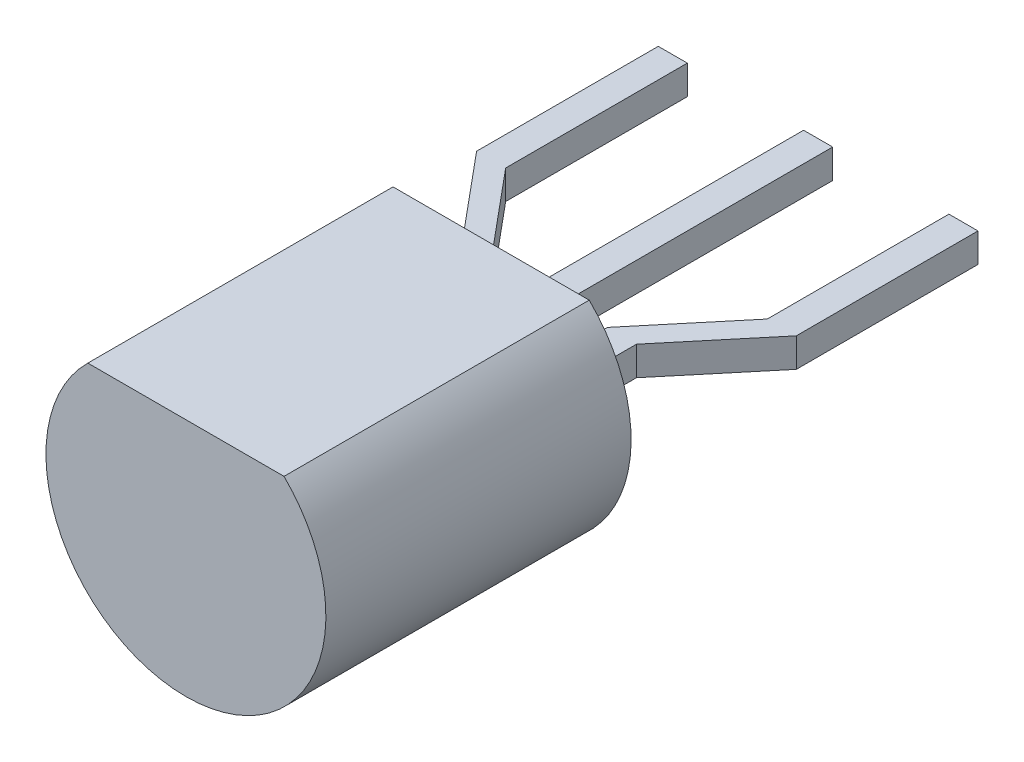
ISO-10303-21;
HEADER;
FILE_DESCRIPTION(('STEP AP214'),'2;1');
FILE_NAME('part.step','',(''),(''),'','','');
FILE_SCHEMA(('AUTOMOTIVE_DESIGN { 1 0 10303 214 1 1 1 1 }'));
ENDSEC;
DATA;
#1=APPLICATION_CONTEXT('core data for automotive mechanical design processes');
#2=APPLICATION_PROTOCOL_DEFINITION('international standard','automotive_design',2000,#1);
#3=PRODUCT_CONTEXT('',#1,'mechanical');
#4=PRODUCT('Part','Part','',(#3));
#5=PRODUCT_RELATED_PRODUCT_CATEGORY('part','',(#4));
#6=PRODUCT_DEFINITION_FORMATION('','',#4);
#7=PRODUCT_DEFINITION_CONTEXT('part definition',#1,'design');
#8=PRODUCT_DEFINITION('design','',#6,#7);
#9=PRODUCT_DEFINITION_SHAPE('','',#8);
#10=(LENGTH_UNIT() NAMED_UNIT(*) SI_UNIT(.MILLI.,.METRE.));
#11=(NAMED_UNIT(*) PLANE_ANGLE_UNIT() SI_UNIT($,.RADIAN.));
#12=(NAMED_UNIT(*) SI_UNIT($,.STERADIAN.) SOLID_ANGLE_UNIT());
#13=UNCERTAINTY_MEASURE_WITH_UNIT(LENGTH_MEASURE(1.E-05),#10,'distance_accuracy_value','');
#14=(GEOMETRIC_REPRESENTATION_CONTEXT(3) GLOBAL_UNCERTAINTY_ASSIGNED_CONTEXT((#13)) GLOBAL_UNIT_ASSIGNED_CONTEXT((#10,
#11,#12)) REPRESENTATION_CONTEXT('',''));
#15=CARTESIAN_POINT('',(0.,0.,0.));
#16=DIRECTION('',(0.,0.,1.));
#17=DIRECTION('',(1.,0.,0.));
#18=AXIS2_PLACEMENT_3D('',#15,#16,#17);
#19=CARTESIAN_POINT('',(48.6387110474384,37.211,1.5367));
#20=DIRECTION('',(1.,0.,0.));
#21=DIRECTION('',(0.,0.,1.));
#22=AXIS2_PLACEMENT_3D('',#19,#20,#21);
#23=PLANE('',#22);
#24=DIRECTION('',(0.,0.,1.));
#25=VECTOR('',#24,1.);
#26=CARTESIAN_POINT('',(48.6387110474384,37.719,1.5367));
#27=LINE('',#26,#25);
#28=CARTESIAN_POINT('',(48.6387110474384,37.719,1.5367));
#29=VERTEX_POINT('',#28);
#30=CARTESIAN_POINT('',(48.6387110474384,37.719,2.5527));
#31=VERTEX_POINT('',#30);
#32=EDGE_CURVE('E11',#29,#31,#27,.T.);
#33=ORIENTED_EDGE('',*,*,#32,.T.);
#34=DIRECTION('',(0.,1.,0.));
#35=VECTOR('',#34,1.);
#36=CARTESIAN_POINT('',(48.6387110474384,37.211,2.5527));
#37=LINE('',#36,#35);
#38=CARTESIAN_POINT('',(48.6387110474384,37.211,2.5527));
#39=VERTEX_POINT('',#38);
#40=EDGE_CURVE('E41',#39,#31,#37,.T.);
#41=ORIENTED_EDGE('',*,*,#40,.F.);
#42=DIRECTION('',(0.,0.,1.));
#43=VECTOR('',#42,1.);
#44=CARTESIAN_POINT('',(48.6387110474384,37.211,1.5367));
#45=LINE('',#44,#43);
#46=CARTESIAN_POINT('',(48.6387110474384,37.211,1.5367));
#47=VERTEX_POINT('',#46);
#48=EDGE_CURVE('E356',#47,#39,#45,.T.);
#49=ORIENTED_EDGE('',*,*,#48,.F.);
#50=DIRECTION('',(0.,1.,0.));
#51=VECTOR('',#50,1.);
#52=CARTESIAN_POINT('',(48.6387110474384,37.211,1.5367));
#53=LINE('',#52,#51);
#54=EDGE_CURVE('E20',#47,#29,#53,.T.);
#55=ORIENTED_EDGE('',*,*,#54,.T.);
#56=EDGE_LOOP('',(#33,#41,#49,#55));
#57=FACE_BOUND('',#56,.T.);
#58=ADVANCED_FACE('F16',(#57),#23,.T.);
#59=CARTESIAN_POINT('',(48.1307110474384,37.211,2.5527));
#60=DIRECTION('',(-1.,0.,0.));
#61=DIRECTION('',(0.,-1.,0.));
#62=AXIS2_PLACEMENT_3D('',#59,#60,#61);
#63=PLANE('',#62);
#64=DIRECTION('',(0.,0.,-1.));
#65=VECTOR('',#64,1.);
#66=CARTESIAN_POINT('',(48.1307110474384,37.719,2.5527));
#67=LINE('',#66,#65);
#68=CARTESIAN_POINT('',(48.1307110474384,37.719,2.5527));
#69=VERTEX_POINT('',#68);
#70=CARTESIAN_POINT('',(48.1307110474384,37.719,1.5367));
#71=VERTEX_POINT('',#70);
#72=EDGE_CURVE('E295',#69,#71,#67,.T.);
#73=ORIENTED_EDGE('',*,*,#72,.T.);
#74=DIRECTION('',(0.,1.,0.));
#75=VECTOR('',#74,1.);
#76=CARTESIAN_POINT('',(48.1307110474384,37.211,1.5367));
#77=LINE('',#76,#75);
#78=CARTESIAN_POINT('',(48.1307110474384,37.211,1.5367));
#79=VERTEX_POINT('',#78);
#80=EDGE_CURVE('E296',#79,#71,#77,.T.);
#81=ORIENTED_EDGE('',*,*,#80,.F.);
#82=DIRECTION('',(0.,0.,-1.));
#83=VECTOR('',#82,1.);
#84=CARTESIAN_POINT('',(48.1307110474384,37.211,2.5527));
#85=LINE('',#84,#83);
#86=CARTESIAN_POINT('',(48.1307110474384,37.211,2.5527));
#87=VERTEX_POINT('',#86);
#88=EDGE_CURVE('E329',#87,#79,#85,.T.);
#89=ORIENTED_EDGE('',*,*,#88,.F.);
#90=DIRECTION('',(0.,-1.,0.));
#91=VECTOR('',#90,1.);
#92=CARTESIAN_POINT('',(48.1307110474384,37.719,2.5527));
#93=LINE('',#92,#91);
#94=EDGE_CURVE('E199',#69,#87,#93,.T.);
#95=ORIENTED_EDGE('',*,*,#94,.F.);
#96=EDGE_LOOP('',(#73,#81,#89,#95));
#97=FACE_BOUND('',#96,.T.);
#98=ADVANCED_FACE('F688',(#97),#63,.T.);
#99=CARTESIAN_POINT('',(48.1307110474384,37.211,1.5367));
#100=DIRECTION('',(-0.768221279597458,0.,-0.640184399664382));
#101=DIRECTION('',(0.,1.,0.));
#102=AXIS2_PLACEMENT_3D('',#99,#100,#101);
#103=PLANE('',#102);
#104=DIRECTION('',(0.640184399664381,0.,-0.768221279597458));
#105=VECTOR('',#104,1.);
#106=CARTESIAN_POINT('',(48.1307110474384,37.719,1.5367));
#107=LINE('',#106,#105);
#108=CARTESIAN_POINT('',(49.4007110474384,37.719,0.0127000000000011));
#109=VERTEX_POINT('',#108);
#110=EDGE_CURVE('E291',#71,#109,#107,.T.);
#111=ORIENTED_EDGE('',*,*,#110,.T.);
#112=DIRECTION('',(0.,1.,0.));
#113=VECTOR('',#112,1.);
#114=CARTESIAN_POINT('',(49.4007110474384,37.211,0.0127000000000011));
#115=LINE('',#114,#113);
#116=CARTESIAN_POINT('',(49.4007110474384,37.211,0.0127000000000011));
#117=VERTEX_POINT('',#116);
#118=EDGE_CURVE('E337',#117,#109,#115,.T.);
#119=ORIENTED_EDGE('',*,*,#118,.F.);
#120=DIRECTION('',(0.640184399664381,0.,-0.768221279597458));
#121=VECTOR('',#120,1.);
#122=CARTESIAN_POINT('',(48.1307110474384,37.211,1.5367));
#123=LINE('',#122,#121);
#124=EDGE_CURVE('E325',#79,#117,#123,.T.);
#125=ORIENTED_EDGE('',*,*,#124,.F.);
#126=ORIENTED_EDGE('',*,*,#80,.T.);
#127=EDGE_LOOP('',(#111,#119,#125,#126));
#128=FACE_BOUND('',#127,.T.);
#129=ADVANCED_FACE('F692',(#128),#103,.T.);
#130=CARTESIAN_POINT('',(49.9087110474384,37.211,0.0127000000000011));
#131=DIRECTION('',(0.768221279597458,0.,0.640184399664382));
#132=DIRECTION('',(0.,-1.,0.));
#133=AXIS2_PLACEMENT_3D('',#130,#131,#132);
#134=PLANE('',#133);
#135=DIRECTION('',(-0.640184399664381,0.,0.768221279597458));
#136=VECTOR('',#135,1.);
#137=CARTESIAN_POINT('',(49.9087110474384,37.719,0.012700000000001));
#138=LINE('',#137,#136);
#139=CARTESIAN_POINT('',(49.9087110474384,37.719,0.0127000000000011));
#140=VERTEX_POINT('',#139);
#141=EDGE_CURVE('E403',#140,#29,#138,.T.);
#142=ORIENTED_EDGE('',*,*,#141,.T.);
#143=ORIENTED_EDGE('',*,*,#54,.F.);
#144=DIRECTION('',(-0.640184399664381,0.,0.768221279597458));
#145=VECTOR('',#144,1.);
#146=CARTESIAN_POINT('',(49.9087110474384,37.211,0.0127000000000011));
#147=LINE('',#146,#145);
#148=CARTESIAN_POINT('',(49.9087110474384,37.211,0.0127000000000011));
#149=VERTEX_POINT('',#148);
#150=EDGE_CURVE('E350',#149,#47,#147,.T.);
#151=ORIENTED_EDGE('',*,*,#150,.F.);
#152=DIRECTION('',(0.,-1.,0.));
#153=VECTOR('',#152,1.);
#154=CARTESIAN_POINT('',(49.9087110474384,37.719,0.0127000000000011));
#155=LINE('',#154,#153);
#156=EDGE_CURVE('E266',#140,#149,#155,.T.);
#157=ORIENTED_EDGE('',*,*,#156,.F.);
#158=EDGE_LOOP('',(#142,#143,#151,#157));
#159=FACE_BOUND('',#158,.T.);
#160=ADVANCED_FACE('F808',(#159),#134,.T.);
#161=CARTESIAN_POINT('',(45.5907110474384,37.211,1.5367));
#162=DIRECTION('',(-0.768221279597458,0.,0.640184399664382));
#163=DIRECTION('',(0.,1.,0.));
#164=AXIS2_PLACEMENT_3D('',#161,#162,#163);
#165=PLANE('',#164);
#166=DIRECTION('',(-0.640184399664381,0.,-0.768221279597458));
#167=VECTOR('',#166,1.);
#168=CARTESIAN_POINT('',(45.5907110474384,37.719,1.5367));
#169=LINE('',#168,#167);
#170=CARTESIAN_POINT('',(45.5907110474384,37.719,1.5367));
#171=VERTEX_POINT('',#170);
#172=CARTESIAN_POINT('',(44.3207110474384,37.719,0.0127000000000011));
#173=VERTEX_POINT('',#172);
#174=EDGE_CURVE('E245',#171,#173,#169,.T.);
#175=ORIENTED_EDGE('',*,*,#174,.T.);
#176=DIRECTION('',(0.,1.,0.));
#177=VECTOR('',#176,1.);
#178=CARTESIAN_POINT('',(44.3207110474384,37.211,0.0127000000000011));
#179=LINE('',#178,#177);
#180=CARTESIAN_POINT('',(44.3207110474384,37.211,0.0127000000000011));
#181=VERTEX_POINT('',#180);
#182=EDGE_CURVE('E341',#181,#173,#179,.T.);
#183=ORIENTED_EDGE('',*,*,#182,.F.);
#184=DIRECTION('',(-0.640184399664381,0.,-0.768221279597458));
#185=VECTOR('',#184,1.);
#186=CARTESIAN_POINT('',(45.5907110474384,37.211,1.5367));
#187=LINE('',#186,#185);
#188=CARTESIAN_POINT('',(45.5907110474384,37.211,1.5367));
#189=VERTEX_POINT('',#188);
#190=EDGE_CURVE('E285',#189,#181,#187,.T.);
#191=ORIENTED_EDGE('',*,*,#190,.F.);
#192=DIRECTION('',(0.,1.,0.));
#193=VECTOR('',#192,1.);
#194=CARTESIAN_POINT('',(45.5907110474384,37.211,1.5367));
#195=LINE('',#194,#193);
#196=EDGE_CURVE('E242',#189,#171,#195,.T.);
#197=ORIENTED_EDGE('',*,*,#196,.T.);
#198=EDGE_LOOP('',(#175,#183,#191,#197));
#199=FACE_BOUND('',#198,.T.);
#200=ADVANCED_FACE('F774',(#199),#165,.T.);
#201=CARTESIAN_POINT('',(45.5907110474384,37.211,2.5527));
#202=DIRECTION('',(-1.,0.,0.));
#203=DIRECTION('',(0.,-1.,0.));
#204=AXIS2_PLACEMENT_3D('',#201,#202,#203);
#205=PLANE('',#204);
#206=DIRECTION('',(0.,0.,-1.));
#207=VECTOR('',#206,1.);
#208=CARTESIAN_POINT('',(45.5907110474384,37.719,2.5527));
#209=LINE('',#208,#207);
#210=CARTESIAN_POINT('',(45.5907110474384,37.719,2.5527));
#211=VERTEX_POINT('',#210);
#212=EDGE_CURVE('E246',#211,#171,#209,.T.);
#213=ORIENTED_EDGE('',*,*,#212,.T.);
#214=ORIENTED_EDGE('',*,*,#196,.F.);
#215=DIRECTION('',(0.,0.,-1.));
#216=VECTOR('',#215,1.);
#217=CARTESIAN_POINT('',(45.5907110474384,37.211,2.5527));
#218=LINE('',#217,#216);
#219=CARTESIAN_POINT('',(45.5907110474384,37.211,2.5527));
#220=VERTEX_POINT('',#219);
#221=EDGE_CURVE('E289',#220,#189,#218,.T.);
#222=ORIENTED_EDGE('',*,*,#221,.F.);
#223=DIRECTION('',(0.,-1.,0.));
#224=VECTOR('',#223,1.);
#225=CARTESIAN_POINT('',(45.5907110474384,37.719,2.5527));
#226=LINE('',#225,#224);
#227=EDGE_CURVE('E297',#211,#220,#226,.T.);
#228=ORIENTED_EDGE('',*,*,#227,.F.);
#229=EDGE_LOOP('',(#213,#214,#222,#228));
#230=FACE_BOUND('',#229,.T.);
#231=ADVANCED_FACE('F770',(#230),#205,.T.);
#232=CARTESIAN_POINT('',(46.0987110474384,37.211,1.5367));
#233=DIRECTION('',(1.,0.,0.));
#234=DIRECTION('',(0.,0.,1.));
#235=AXIS2_PLACEMENT_3D('',#232,#233,#234);
#236=PLANE('',#235);
#237=DIRECTION('',(0.,0.,1.));
#238=VECTOR('',#237,1.);
#239=CARTESIAN_POINT('',(46.0987110474384,37.719,1.5367));
#240=LINE('',#239,#238);
#241=CARTESIAN_POINT('',(46.0987110474384,37.719,1.5367));
#242=VERTEX_POINT('',#241);
#243=CARTESIAN_POINT('',(46.0987110474384,37.719,2.5527));
#244=VERTEX_POINT('',#243);
#245=EDGE_CURVE('E260',#242,#244,#240,.T.);
#246=ORIENTED_EDGE('',*,*,#245,.T.);
#247=DIRECTION('',(0.,1.,0.));
#248=VECTOR('',#247,1.);
#249=CARTESIAN_POINT('',(46.0987110474384,37.211,2.5527));
#250=LINE('',#249,#248);
#251=CARTESIAN_POINT('',(46.0987110474384,37.211,2.5527));
#252=VERTEX_POINT('',#251);
#253=EDGE_CURVE('E306',#252,#244,#250,.T.);
#254=ORIENTED_EDGE('',*,*,#253,.F.);
#255=DIRECTION('',(0.,0.,1.));
#256=VECTOR('',#255,1.);
#257=CARTESIAN_POINT('',(46.0987110474384,37.211,1.5367));
#258=LINE('',#257,#256);
#259=CARTESIAN_POINT('',(46.0987110474384,37.211,1.5367));
#260=VERTEX_POINT('',#259);
#261=EDGE_CURVE('E319',#260,#252,#258,.T.);
#262=ORIENTED_EDGE('',*,*,#261,.F.);
#263=DIRECTION('',(0.,1.,0.));
#264=VECTOR('',#263,1.);
#265=CARTESIAN_POINT('',(46.0987110474384,37.211,1.5367));
#266=LINE('',#265,#264);
#267=EDGE_CURVE('E264',#260,#242,#266,.T.);
#268=ORIENTED_EDGE('',*,*,#267,.T.);
#269=EDGE_LOOP('',(#246,#254,#262,#268));
#270=FACE_BOUND('',#269,.T.);
#271=ADVANCED_FACE('F761',(#270),#236,.T.);
#272=CARTESIAN_POINT('',(44.8287110474384,37.211,0.0127000000000011));
#273=DIRECTION('',(0.768221279597458,0.,-0.640184399664382));
#274=DIRECTION('',(0.640184399664382,0.,0.768221279597458));
#275=AXIS2_PLACEMENT_3D('',#272,#273,#274);
#276=PLANE('',#275);
#277=DIRECTION('',(0.640184399664381,0.,0.768221279597458));
#278=VECTOR('',#277,1.);
#279=CARTESIAN_POINT('',(44.8287110474384,37.719,0.0127000000000012));
#280=LINE('',#279,#278);
#281=CARTESIAN_POINT('',(44.8287110474384,37.719,0.0127000000000011));
#282=VERTEX_POINT('',#281);
#283=EDGE_CURVE('E370',#282,#242,#280,.T.);
#284=ORIENTED_EDGE('',*,*,#283,.T.);
#285=ORIENTED_EDGE('',*,*,#267,.F.);
#286=DIRECTION('',(0.640184399664381,0.,0.768221279597458));
#287=VECTOR('',#286,1.);
#288=CARTESIAN_POINT('',(44.8287110474384,37.211,0.0127000000000011));
#289=LINE('',#288,#287);
#290=CARTESIAN_POINT('',(44.8287110474384,37.211,0.0127000000000011));
#291=VERTEX_POINT('',#290);
#292=EDGE_CURVE('E314',#291,#260,#289,.T.);
#293=ORIENTED_EDGE('',*,*,#292,.F.);
#294=DIRECTION('',(0.,-1.,0.));
#295=VECTOR('',#294,1.);
#296=CARTESIAN_POINT('',(44.8287110474384,37.719,0.0127000000000011));
#297=LINE('',#296,#295);
#298=EDGE_CURVE('E323',#282,#291,#297,.T.);
#299=ORIENTED_EDGE('',*,*,#298,.F.);
#300=EDGE_LOOP('',(#284,#285,#293,#299));
#301=FACE_BOUND('',#300,.T.);
#302=ADVANCED_FACE('F756',(#301),#276,.T.);
#303=CARTESIAN_POINT('',(47.1147110474384,37.2441931818181,2.5527));
#304=DIRECTION('',(0.,0.,1.));
#305=DIRECTION('',(-0.700884955752197,0.713274336283201,0.));
#306=AXIS2_PLACEMENT_3D('',#303,#304,#305);
#307=CYLINDRICAL_SURFACE('',#306,2.446193181818);
#308=CARTESIAN_POINT('',(47.1147110474384,37.2441931818181,7.8867));
#309=DIRECTION('',(0.,0.,-1.));
#310=DIRECTION('',(-0.700884955752197,0.713274336283201,0.));
#311=AXIS2_PLACEMENT_3D('',#308,#309,#310);
#312=CIRCLE('',#311,2.446193181818);
#313=CARTESIAN_POINT('',(48.8292110474384,38.989,7.8867));
#314=VERTEX_POINT('',#313);
#315=CARTESIAN_POINT('',(45.4002110474384,38.989,7.8867));
#316=VERTEX_POINT('',#315);
#317=EDGE_CURVE('E374',#314,#316,#312,.T.);
#318=ORIENTED_EDGE('',*,*,#317,.T.);
#319=DIRECTION('',(0.,0.,1.));
#320=VECTOR('',#319,1.);
#321=CARTESIAN_POINT('',(45.4002110474384,38.989,2.5527));
#322=LINE('',#321,#320);
#323=CARTESIAN_POINT('',(45.4002110474384,38.989,2.5527));
#324=VERTEX_POINT('',#323);
#325=EDGE_CURVE('E259',#324,#316,#322,.T.);
#326=ORIENTED_EDGE('',*,*,#325,.F.);
#327=CARTESIAN_POINT('',(47.1147110474384,37.2441931818181,2.5527));
#328=DIRECTION('',(0.,0.,1.));
#329=DIRECTION('',(-0.700884955752197,0.713274336283201,0.));
#330=AXIS2_PLACEMENT_3D('',#327,#328,#329);
#331=CIRCLE('',#330,2.446193181818);
#332=CARTESIAN_POINT('',(48.8292110474384,38.989,2.5527));
#333=VERTEX_POINT('',#332);
#334=EDGE_CURVE('E378',#324,#333,#331,.T.);
#335=ORIENTED_EDGE('',*,*,#334,.T.);
#336=DIRECTION('',(0.,0.,1.));
#337=VECTOR('',#336,1.);
#338=CARTESIAN_POINT('',(48.8292110474384,38.989,2.5527));
#339=LINE('',#338,#337);
#340=EDGE_CURVE('E251',#333,#314,#339,.T.);
#341=ORIENTED_EDGE('',*,*,#340,.T.);
#342=EDGE_LOOP('',(#318,#326,#335,#341));
#343=FACE_BOUND('',#342,.T.);
#344=ADVANCED_FACE('F760',(#343),#307,.T.);
#345=CARTESIAN_POINT('',(45.4002110474384,38.989,2.5527));
#346=DIRECTION('',(0.,1.,0.));
#347=DIRECTION('',(0.,0.,-1.));
#348=AXIS2_PLACEMENT_3D('',#345,#346,#347);
#349=PLANE('',#348);
#350=DIRECTION('',(1.,0.,0.));
#351=VECTOR('',#350,1.);
#352=CARTESIAN_POINT('',(45.4002110474384,38.989,7.8867));
#353=LINE('',#352,#351);
#354=EDGE_CURVE('E247',#316,#314,#353,.T.);
#355=ORIENTED_EDGE('',*,*,#354,.T.);
#356=ORIENTED_EDGE('',*,*,#340,.F.);
#357=DIRECTION('',(-1.,0.,0.));
#358=VECTOR('',#357,1.);
#359=CARTESIAN_POINT('',(48.8292110474384,38.989,2.5527));
#360=LINE('',#359,#358);
#361=EDGE_CURVE('E252',#333,#324,#360,.T.);
#362=ORIENTED_EDGE('',*,*,#361,.T.);
#363=ORIENTED_EDGE('',*,*,#325,.T.);
#364=EDGE_LOOP('',(#355,#356,#362,#363));
#365=FACE_BOUND('',#364,.T.);
#366=ADVANCED_FACE('F796',(#365),#349,.T.);
#367=CARTESIAN_POINT('',(47.1147110474384,37.266557695124,2.5527));
#368=DIRECTION('',(0.,0.,1.));
#369=DIRECTION('',(-1.,0.,0.));
#370=AXIS2_PLACEMENT_3D('',#367,#368,#369);
#371=PLANE('',#370);
#372=ORIENTED_EDGE('',*,*,#361,.F.);
#373=ORIENTED_EDGE('',*,*,#334,.F.);
#374=EDGE_LOOP('',(#372,#373));
#375=FACE_BOUND('',#374,.T.);
#376=DIRECTION('',(0.,-1.,0.));
#377=VECTOR('',#376,1.);
#378=CARTESIAN_POINT('',(46.8607110474384,37.719,2.5527));
#379=LINE('',#378,#377);
#380=CARTESIAN_POINT('',(46.8607110474384,37.719,2.5527));
#381=VERTEX_POINT('',#380);
#382=CARTESIAN_POINT('',(46.8607110474384,37.211,2.5527));
#383=VERTEX_POINT('',#382);
#384=EDGE_CURVE('E309',#381,#383,#379,.T.);
#385=ORIENTED_EDGE('',*,*,#384,.T.);
#386=DIRECTION('',(1.,0.,0.));
#387=VECTOR('',#386,1.);
#388=CARTESIAN_POINT('',(46.8607110474384,37.211,2.5527));
#389=LINE('',#388,#387);
#390=CARTESIAN_POINT('',(47.3687110474384,37.211,2.5527));
#391=VERTEX_POINT('',#390);
#392=EDGE_CURVE('E203',#383,#391,#389,.T.);
#393=ORIENTED_EDGE('',*,*,#392,.T.);
#394=DIRECTION('',(0.,1.,0.));
#395=VECTOR('',#394,1.);
#396=CARTESIAN_POINT('',(47.3687110474384,37.211,2.5527));
#397=LINE('',#396,#395);
#398=CARTESIAN_POINT('',(47.3687110474384,37.719,2.5527));
#399=VERTEX_POINT('',#398);
#400=EDGE_CURVE('E198',#391,#399,#397,.T.);
#401=ORIENTED_EDGE('',*,*,#400,.T.);
#402=DIRECTION('',(-1.,0.,0.));
#403=VECTOR('',#402,1.);
#404=CARTESIAN_POINT('',(47.3687110474384,37.719,2.5527));
#405=LINE('',#404,#403);
#406=EDGE_CURVE('E186',#399,#381,#405,.T.);
#407=ORIENTED_EDGE('',*,*,#406,.T.);
#408=EDGE_LOOP('',(#385,#393,#401,#407));
#409=FACE_BOUND('',#408,.T.);
#410=ORIENTED_EDGE('',*,*,#94,.T.);
#411=DIRECTION('',(1.,0.,0.));
#412=VECTOR('',#411,1.);
#413=CARTESIAN_POINT('',(48.1307110474384,37.211,2.5527));
#414=LINE('',#413,#412);
#415=EDGE_CURVE('E267',#87,#39,#414,.T.);
#416=ORIENTED_EDGE('',*,*,#415,.T.);
#417=ORIENTED_EDGE('',*,*,#40,.T.);
#418=DIRECTION('',(-1.,0.,0.));
#419=VECTOR('',#418,1.);
#420=CARTESIAN_POINT('',(48.6387110474384,37.719,2.5527));
#421=LINE('',#420,#419);
#422=EDGE_CURVE('E276',#31,#69,#421,.T.);
#423=ORIENTED_EDGE('',*,*,#422,.T.);
#424=EDGE_LOOP('',(#410,#416,#417,#423));
#425=FACE_BOUND('',#424,.T.);
#426=DIRECTION('',(1.,0.,0.));
#427=VECTOR('',#426,1.);
#428=CARTESIAN_POINT('',(45.5907110474384,37.211,2.5527));
#429=LINE('',#428,#427);
#430=EDGE_CURVE('E281',#220,#252,#429,.T.);
#431=ORIENTED_EDGE('',*,*,#430,.T.);
#432=ORIENTED_EDGE('',*,*,#253,.T.);
#433=DIRECTION('',(-1.,0.,0.));
#434=VECTOR('',#433,1.);
#435=CARTESIAN_POINT('',(46.0987110474384,37.719,2.5527));
#436=LINE('',#435,#434);
#437=EDGE_CURVE('E301',#244,#211,#436,.T.);
#438=ORIENTED_EDGE('',*,*,#437,.T.);
#439=ORIENTED_EDGE('',*,*,#227,.T.);
#440=EDGE_LOOP('',(#431,#432,#438,#439));
#441=FACE_BOUND('',#440,.T.);
#442=ADVANCED_FACE('F202',(#375,#409,#425,#441),#371,.F.);
#443=CARTESIAN_POINT('',(47.1147110474384,37.266557695124,7.8867));
#444=DIRECTION('',(0.,0.,1.));
#445=DIRECTION('',(-1.,0.,0.));
#446=AXIS2_PLACEMENT_3D('',#443,#444,#445);
#447=PLANE('',#446);
#448=ORIENTED_EDGE('',*,*,#317,.F.);
#449=ORIENTED_EDGE('',*,*,#354,.F.);
#450=EDGE_LOOP('',(#448,#449));
#451=FACE_BOUND('',#450,.T.);
#452=ADVANCED_FACE('F679',(#451),#447,.T.);
#453=CARTESIAN_POINT('',(44.8287110474384,37.211,0.0127000000000011));
#454=DIRECTION('',(1.,0.,0.));
#455=DIRECTION('',(0.,0.,1.));
#456=AXIS2_PLACEMENT_3D('',#453,#454,#455);
#457=PLANE('',#456);
#458=DIRECTION('',(0.,1.,0.));
#459=VECTOR('',#458,1.);
#460=CARTESIAN_POINT('',(44.8287110474384,37.211,-3.1623));
#461=LINE('',#460,#459);
#462=CARTESIAN_POINT('',(44.8287110474384,37.211,-3.1623));
#463=VERTEX_POINT('',#462);
#464=CARTESIAN_POINT('',(44.8287110474384,37.719,-3.1623));
#465=VERTEX_POINT('',#464);
#466=EDGE_CURVE('E302',#463,#465,#461,.T.);
#467=ORIENTED_EDGE('',*,*,#466,.T.);
#468=DIRECTION('',(0.,0.,-1.));
#469=VECTOR('',#468,1.);
#470=CARTESIAN_POINT('',(44.8287110474384,37.719,0.0127000000000011));
#471=LINE('',#470,#469);
#472=EDGE_CURVE('E360',#282,#465,#471,.T.);
#473=ORIENTED_EDGE('',*,*,#472,.F.);
#474=ORIENTED_EDGE('',*,*,#298,.T.);
#475=DIRECTION('',(0.,0.,-1.));
#476=VECTOR('',#475,1.);
#477=CARTESIAN_POINT('',(44.8287110474384,37.211,0.0127000000000011));
#478=LINE('',#477,#476);
#479=EDGE_CURVE('E320',#291,#463,#478,.T.);
#480=ORIENTED_EDGE('',*,*,#479,.T.);
#481=EDGE_LOOP('',(#467,#473,#474,#480));
#482=FACE_BOUND('',#481,.T.);
#483=ADVANCED_FACE('F632',(#482),#457,.T.);
#484=CARTESIAN_POINT('',(44.8287110474384,37.719,0.0127000000000011));
#485=DIRECTION('',(0.,1.,0.));
#486=DIRECTION('',(0.,0.,-1.));
#487=AXIS2_PLACEMENT_3D('',#484,#485,#486);
#488=PLANE('',#487);
#489=DIRECTION('',(-1.,0.,0.));
#490=VECTOR('',#489,1.);
#491=CARTESIAN_POINT('',(44.8287110474384,37.719,-3.1623));
#492=LINE('',#491,#490);
#493=CARTESIAN_POINT('',(44.3207110474384,37.719,-3.1623));
#494=VERTEX_POINT('',#493);
#495=EDGE_CURVE('E324',#465,#494,#492,.T.);
#496=ORIENTED_EDGE('',*,*,#495,.T.);
#497=DIRECTION('',(0.,0.,-1.));
#498=VECTOR('',#497,1.);
#499=CARTESIAN_POINT('',(44.3207110474384,37.719,0.0127000000000011));
#500=LINE('',#499,#498);
#501=EDGE_CURVE('E313',#173,#494,#500,.T.);
#502=ORIENTED_EDGE('',*,*,#501,.F.);
#503=ORIENTED_EDGE('',*,*,#174,.F.);
#504=ORIENTED_EDGE('',*,*,#212,.F.);
#505=ORIENTED_EDGE('',*,*,#437,.F.);
#506=ORIENTED_EDGE('',*,*,#245,.F.);
#507=ORIENTED_EDGE('',*,*,#283,.F.);
#508=ORIENTED_EDGE('',*,*,#472,.T.);
#509=EDGE_LOOP('',(#496,#502,#503,#504,#505,#506,#507,#508));
#510=FACE_BOUND('',#509,.T.);
#511=ADVANCED_FACE('F18',(#510),#488,.T.);
#512=CARTESIAN_POINT('',(44.3207110474384,37.719,0.0127000000000011));
#513=DIRECTION('',(-1.,0.,0.));
#514=DIRECTION('',(0.,-1.,0.));
#515=AXIS2_PLACEMENT_3D('',#512,#513,#514);
#516=PLANE('',#515);
#517=DIRECTION('',(0.,-1.,0.));
#518=VECTOR('',#517,1.);
#519=CARTESIAN_POINT('',(44.3207110474384,37.719,-3.1623));
#520=LINE('',#519,#518);
#521=CARTESIAN_POINT('',(44.3207110474384,37.211,-3.1623));
#522=VERTEX_POINT('',#521);
#523=EDGE_CURVE('E386',#494,#522,#520,.T.);
#524=ORIENTED_EDGE('',*,*,#523,.T.);
#525=DIRECTION('',(0.,0.,-1.));
#526=VECTOR('',#525,1.);
#527=CARTESIAN_POINT('',(44.3207110474384,37.211,0.0127000000000011));
#528=LINE('',#527,#526);
#529=EDGE_CURVE('E290',#181,#522,#528,.T.);
#530=ORIENTED_EDGE('',*,*,#529,.F.);
#531=ORIENTED_EDGE('',*,*,#182,.T.);
#532=ORIENTED_EDGE('',*,*,#501,.T.);
#533=EDGE_LOOP('',(#524,#530,#531,#532));
#534=FACE_BOUND('',#533,.T.);
#535=ADVANCED_FACE('F631',(#534),#516,.T.);
#536=CARTESIAN_POINT('',(44.3207110474384,37.211,0.0127000000000011));
#537=DIRECTION('',(0.,-1.,0.));
#538=DIRECTION('',(-1.,0.,0.));
#539=AXIS2_PLACEMENT_3D('',#536,#537,#538);
#540=PLANE('',#539);
#541=DIRECTION('',(1.,0.,0.));
#542=VECTOR('',#541,1.);
#543=CARTESIAN_POINT('',(44.3207110474384,37.211,-3.1623));
#544=LINE('',#543,#542);
#545=EDGE_CURVE('E310',#522,#463,#544,.T.);
#546=ORIENTED_EDGE('',*,*,#545,.T.);
#547=ORIENTED_EDGE('',*,*,#479,.F.);
#548=ORIENTED_EDGE('',*,*,#292,.T.);
#549=ORIENTED_EDGE('',*,*,#261,.T.);
#550=ORIENTED_EDGE('',*,*,#430,.F.);
#551=ORIENTED_EDGE('',*,*,#221,.T.);
#552=ORIENTED_EDGE('',*,*,#190,.T.);
#553=ORIENTED_EDGE('',*,*,#529,.T.);
#554=EDGE_LOOP('',(#546,#547,#548,#549,#550,#551,#552,#553));
#555=FACE_BOUND('',#554,.T.);
#556=ADVANCED_FACE('F429',(#555),#540,.T.);
#557=CARTESIAN_POINT('',(44.5747110474384,37.465,-3.1623));
#558=DIRECTION('',(0.,0.,1.));
#559=DIRECTION('',(-1.,0.,0.));
#560=AXIS2_PLACEMENT_3D('',#557,#558,#559);
#561=PLANE('',#560);
#562=ORIENTED_EDGE('',*,*,#466,.F.);
#563=ORIENTED_EDGE('',*,*,#545,.F.);
#564=ORIENTED_EDGE('',*,*,#523,.F.);
#565=ORIENTED_EDGE('',*,*,#495,.F.);
#566=EDGE_LOOP('',(#562,#563,#564,#565));
#567=FACE_BOUND('',#566,.T.);
#568=ADVANCED_FACE('F655',(#567),#561,.F.);
#569=CARTESIAN_POINT('',(49.9087110474384,37.211,0.0127000000000011));
#570=DIRECTION('',(1.,0.,0.));
#571=DIRECTION('',(0.,0.,1.));
#572=AXIS2_PLACEMENT_3D('',#569,#570,#571);
#573=PLANE('',#572);
#574=DIRECTION('',(0.,1.,0.));
#575=VECTOR('',#574,1.);
#576=CARTESIAN_POINT('',(49.9087110474384,37.211,-3.1623));
#577=LINE('',#576,#575);
#578=CARTESIAN_POINT('',(49.9087110474384,37.211,-3.1623));
#579=VERTEX_POINT('',#578);
#580=CARTESIAN_POINT('',(49.9087110474384,37.719,-3.1623));
#581=VERTEX_POINT('',#580);
#582=EDGE_CURVE('E333',#579,#581,#577,.T.);
#583=ORIENTED_EDGE('',*,*,#582,.T.);
#584=DIRECTION('',(0.,0.,-1.));
#585=VECTOR('',#584,1.);
#586=CARTESIAN_POINT('',(49.9087110474384,37.719,0.0127000000000011));
#587=LINE('',#586,#585);
#588=EDGE_CURVE('E241',#140,#581,#587,.T.);
#589=ORIENTED_EDGE('',*,*,#588,.F.);
#590=ORIENTED_EDGE('',*,*,#156,.T.);
#591=DIRECTION('',(0.,0.,-1.));
#592=VECTOR('',#591,1.);
#593=CARTESIAN_POINT('',(49.9087110474384,37.211,0.0127000000000011));
#594=LINE('',#593,#592);
#595=EDGE_CURVE('E240',#149,#579,#594,.T.);
#596=ORIENTED_EDGE('',*,*,#595,.T.);
#597=EDGE_LOOP('',(#583,#589,#590,#596));
#598=FACE_BOUND('',#597,.T.);
#599=ADVANCED_FACE('F667',(#598),#573,.T.);
#600=CARTESIAN_POINT('',(49.9087110474384,37.719,0.0127000000000011));
#601=DIRECTION('',(0.,1.,0.));
#602=DIRECTION('',(0.,0.,-1.));
#603=AXIS2_PLACEMENT_3D('',#600,#601,#602);
#604=PLANE('',#603);
#605=DIRECTION('',(-1.,0.,0.));
#606=VECTOR('',#605,1.);
#607=CARTESIAN_POINT('',(49.9087110474384,37.719,-3.1623));
#608=LINE('',#607,#606);
#609=CARTESIAN_POINT('',(49.4007110474384,37.719,-3.1623));
#610=VERTEX_POINT('',#609);
#611=EDGE_CURVE('E236',#581,#610,#608,.T.);
#612=ORIENTED_EDGE('',*,*,#611,.T.);
#613=DIRECTION('',(0.,0.,-1.));
#614=VECTOR('',#613,1.);
#615=CARTESIAN_POINT('',(49.4007110474384,37.719,0.0127000000000011));
#616=LINE('',#615,#614);
#617=EDGE_CURVE('E334',#109,#610,#616,.T.);
#618=ORIENTED_EDGE('',*,*,#617,.F.);
#619=ORIENTED_EDGE('',*,*,#110,.F.);
#620=ORIENTED_EDGE('',*,*,#72,.F.);
#621=ORIENTED_EDGE('',*,*,#422,.F.);
#622=ORIENTED_EDGE('',*,*,#32,.F.);
#623=ORIENTED_EDGE('',*,*,#141,.F.);
#624=ORIENTED_EDGE('',*,*,#588,.T.);
#625=EDGE_LOOP('',(#612,#618,#619,#620,#621,#622,#623,#624));
#626=FACE_BOUND('',#625,.T.);
#627=ADVANCED_FACE('F663',(#626),#604,.T.);
#628=CARTESIAN_POINT('',(49.4007110474384,37.719,0.0127000000000011));
#629=DIRECTION('',(-1.,0.,0.));
#630=DIRECTION('',(0.,-1.,0.));
#631=AXIS2_PLACEMENT_3D('',#628,#629,#630);
#632=PLANE('',#631);
#633=DIRECTION('',(0.,-1.,0.));
#634=VECTOR('',#633,1.);
#635=CARTESIAN_POINT('',(49.4007110474384,37.719,-3.1623));
#636=LINE('',#635,#634);
#637=CARTESIAN_POINT('',(49.4007110474384,37.211,-3.1623));
#638=VERTEX_POINT('',#637);
#639=EDGE_CURVE('E395',#610,#638,#636,.T.);
#640=ORIENTED_EDGE('',*,*,#639,.T.);
#641=DIRECTION('',(0.,0.,-1.));
#642=VECTOR('',#641,1.);
#643=CARTESIAN_POINT('',(49.4007110474384,37.211,0.0127000000000011));
#644=LINE('',#643,#642);
#645=EDGE_CURVE('E255',#117,#638,#644,.T.);
#646=ORIENTED_EDGE('',*,*,#645,.F.);
#647=ORIENTED_EDGE('',*,*,#118,.T.);
#648=ORIENTED_EDGE('',*,*,#617,.T.);
#649=EDGE_LOOP('',(#640,#646,#647,#648));
#650=FACE_BOUND('',#649,.T.);
#651=ADVANCED_FACE('F644',(#650),#632,.T.);
#652=CARTESIAN_POINT('',(49.4007110474384,37.211,0.0127000000000011));
#653=DIRECTION('',(0.,-1.,0.));
#654=DIRECTION('',(-1.,0.,0.));
#655=AXIS2_PLACEMENT_3D('',#652,#653,#654);
#656=PLANE('',#655);
#657=DIRECTION('',(1.,0.,0.));
#658=VECTOR('',#657,1.);
#659=CARTESIAN_POINT('',(49.4007110474384,37.211,-3.1623));
#660=LINE('',#659,#658);
#661=EDGE_CURVE('E338',#638,#579,#660,.T.);
#662=ORIENTED_EDGE('',*,*,#661,.T.);
#663=ORIENTED_EDGE('',*,*,#595,.F.);
#664=ORIENTED_EDGE('',*,*,#150,.T.);
#665=ORIENTED_EDGE('',*,*,#48,.T.);
#666=ORIENTED_EDGE('',*,*,#415,.F.);
#667=ORIENTED_EDGE('',*,*,#88,.T.);
#668=ORIENTED_EDGE('',*,*,#124,.T.);
#669=ORIENTED_EDGE('',*,*,#645,.T.);
#670=EDGE_LOOP('',(#662,#663,#664,#665,#666,#667,#668,#669));
#671=FACE_BOUND('',#670,.T.);
#672=ADVANCED_FACE('F639',(#671),#656,.T.);
#673=CARTESIAN_POINT('',(49.6547110474384,37.465,-3.1623));
#674=DIRECTION('',(0.,0.,1.));
#675=DIRECTION('',(-1.,0.,0.));
#676=AXIS2_PLACEMENT_3D('',#673,#674,#675);
#677=PLANE('',#676);
#678=ORIENTED_EDGE('',*,*,#582,.F.);
#679=ORIENTED_EDGE('',*,*,#661,.F.);
#680=ORIENTED_EDGE('',*,*,#639,.F.);
#681=ORIENTED_EDGE('',*,*,#611,.F.);
#682=EDGE_LOOP('',(#678,#679,#680,#681));
#683=FACE_BOUND('',#682,.T.);
#684=ADVANCED_FACE('F643',(#683),#677,.F.);
#685=CARTESIAN_POINT('',(47.3687110474384,37.211,0.0127000000000011));
#686=DIRECTION('',(1.,0.,0.));
#687=DIRECTION('',(0.,0.,1.));
#688=AXIS2_PLACEMENT_3D('',#685,#686,#687);
#689=PLANE('',#688);
#690=DIRECTION('',(0.,1.,0.));
#691=VECTOR('',#690,1.);
#692=CARTESIAN_POINT('',(47.3687110474384,37.211,-3.1623));
#693=LINE('',#692,#691);
#694=CARTESIAN_POINT('',(47.3687110474384,37.211,-3.1623));
#695=VERTEX_POINT('',#694);
#696=CARTESIAN_POINT('',(47.3687110474384,37.719,-3.1623));
#697=VERTEX_POINT('',#696);
#698=EDGE_CURVE('E210',#695,#697,#693,.T.);
#699=ORIENTED_EDGE('',*,*,#698,.T.);
#700=DIRECTION('',(0.,0.,-1.));
#701=VECTOR('',#700,1.);
#702=CARTESIAN_POINT('',(47.3687110474384,37.719,2.5527));
#703=LINE('',#702,#701);
#704=EDGE_CURVE('E191',#399,#697,#703,.T.);
#705=ORIENTED_EDGE('',*,*,#704,.F.);
#706=ORIENTED_EDGE('',*,*,#400,.F.);
#707=DIRECTION('',(0.,0.,1.));
#708=VECTOR('',#707,1.);
#709=CARTESIAN_POINT('',(47.3687110474384,37.211,-3.1623));
#710=LINE('',#709,#708);
#711=EDGE_CURVE('E229',#695,#391,#710,.T.);
#712=ORIENTED_EDGE('',*,*,#711,.F.);
#713=EDGE_LOOP('',(#699,#705,#706,#712));
#714=FACE_BOUND('',#713,.T.);
#715=ADVANCED_FACE('F208',(#714),#689,.T.);
#716=CARTESIAN_POINT('',(47.3687110474384,37.719,0.0127000000000011));
#717=DIRECTION('',(0.,1.,0.));
#718=DIRECTION('',(0.,0.,-1.));
#719=AXIS2_PLACEMENT_3D('',#716,#717,#718);
#720=PLANE('',#719);
#721=DIRECTION('',(-1.,0.,0.));
#722=VECTOR('',#721,1.);
#723=CARTESIAN_POINT('',(47.3687110474384,37.719,-3.1623));
#724=LINE('',#723,#722);
#725=CARTESIAN_POINT('',(46.8607110474384,37.719,-3.1623));
#726=VERTEX_POINT('',#725);
#727=EDGE_CURVE('E213',#697,#726,#724,.T.);
#728=ORIENTED_EDGE('',*,*,#727,.T.);
#729=DIRECTION('',(0.,0.,-1.));
#730=VECTOR('',#729,1.);
#731=CARTESIAN_POINT('',(46.8607110474384,37.719,2.5527));
#732=LINE('',#731,#730);
#733=EDGE_CURVE('E193',#381,#726,#732,.T.);
#734=ORIENTED_EDGE('',*,*,#733,.F.);
#735=ORIENTED_EDGE('',*,*,#406,.F.);
#736=ORIENTED_EDGE('',*,*,#704,.T.);
#737=EDGE_LOOP('',(#728,#734,#735,#736));
#738=FACE_BOUND('',#737,.T.);
#739=ADVANCED_FACE('F189',(#738),#720,.T.);
#740=CARTESIAN_POINT('',(46.8607110474384,37.719,0.0127000000000011));
#741=DIRECTION('',(-1.,0.,0.));
#742=DIRECTION('',(0.,-1.,0.));
#743=AXIS2_PLACEMENT_3D('',#740,#741,#742);
#744=PLANE('',#743);
#745=DIRECTION('',(0.,-1.,0.));
#746=VECTOR('',#745,1.);
#747=CARTESIAN_POINT('',(46.8607110474384,37.719,-3.1623));
#748=LINE('',#747,#746);
#749=CARTESIAN_POINT('',(46.8607110474384,37.211,-3.1623));
#750=VERTEX_POINT('',#749);
#751=EDGE_CURVE('E214',#726,#750,#748,.T.);
#752=ORIENTED_EDGE('',*,*,#751,.T.);
#753=DIRECTION('',(0.,0.,-1.));
#754=VECTOR('',#753,1.);
#755=CARTESIAN_POINT('',(46.8607110474384,37.211,2.5527));
#756=LINE('',#755,#754);
#757=EDGE_CURVE('E226',#383,#750,#756,.T.);
#758=ORIENTED_EDGE('',*,*,#757,.F.);
#759=ORIENTED_EDGE('',*,*,#384,.F.);
#760=ORIENTED_EDGE('',*,*,#733,.T.);
#761=EDGE_LOOP('',(#752,#758,#759,#760));
#762=FACE_BOUND('',#761,.T.);
#763=ADVANCED_FACE('F853',(#762),#744,.T.);
#764=CARTESIAN_POINT('',(46.8607110474384,37.211,0.0127000000000011));
#765=DIRECTION('',(0.,-1.,0.));
#766=DIRECTION('',(-1.,0.,0.));
#767=AXIS2_PLACEMENT_3D('',#764,#765,#766);
#768=PLANE('',#767);
#769=DIRECTION('',(1.,0.,0.));
#770=VECTOR('',#769,1.);
#771=CARTESIAN_POINT('',(46.8607110474384,37.211,-3.1623));
#772=LINE('',#771,#770);
#773=EDGE_CURVE('E230',#750,#695,#772,.T.);
#774=ORIENTED_EDGE('',*,*,#773,.T.);
#775=ORIENTED_EDGE('',*,*,#711,.T.);
#776=ORIENTED_EDGE('',*,*,#392,.F.);
#777=ORIENTED_EDGE('',*,*,#757,.T.);
#778=EDGE_LOOP('',(#774,#775,#776,#777));
#779=FACE_BOUND('',#778,.T.);
#780=ADVANCED_FACE('F715',(#779),#768,.T.);
#781=CARTESIAN_POINT('',(47.1147110474384,37.465,-3.1623));
#782=DIRECTION('',(0.,0.,1.));
#783=DIRECTION('',(-1.,0.,0.));
#784=AXIS2_PLACEMENT_3D('',#781,#782,#783);
#785=PLANE('',#784);
#786=ORIENTED_EDGE('',*,*,#698,.F.);
#787=ORIENTED_EDGE('',*,*,#773,.F.);
#788=ORIENTED_EDGE('',*,*,#751,.F.);
#789=ORIENTED_EDGE('',*,*,#727,.F.);
#790=EDGE_LOOP('',(#786,#787,#788,#789));
#791=FACE_BOUND('',#790,.T.);
#792=ADVANCED_FACE('F711',(#791),#785,.F.);
#793=CLOSED_SHELL('',(#58,#98,#129,#160,#200,#231,#271,#302,#344,#366,#442,#452,#483,#511,#535,
#556,#568,#599,#627,#651,#672,#684,#715,#739,#763,#780,#792));
#794=MANIFOLD_SOLID_BREP('B1',#793);
#795=ADVANCED_BREP_SHAPE_REPRESENTATION('',(#18,#794),#14);
#796=SHAPE_DEFINITION_REPRESENTATION(#9,#795);
ENDSEC;
END-ISO-10303-21;
